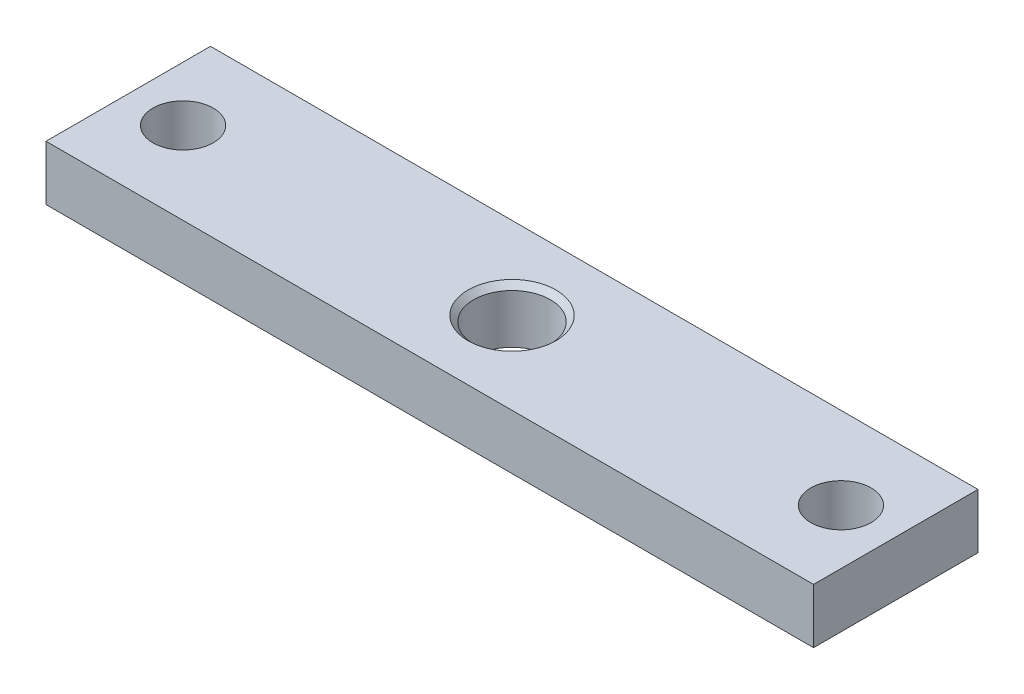
ISO-10303-21;
HEADER;
FILE_DESCRIPTION(('STEP AP214'),'2;1');
FILE_NAME('part.step','',(''),(''),'','','');
FILE_SCHEMA(('AUTOMOTIVE_DESIGN { 1 0 10303 214 1 1 1 1 }'));
ENDSEC;
DATA;
#1=APPLICATION_CONTEXT('core data for automotive mechanical design processes');
#2=APPLICATION_PROTOCOL_DEFINITION('international standard','automotive_design',2000,#1);
#3=PRODUCT_CONTEXT('',#1,'mechanical');
#4=PRODUCT('Part','Part','',(#3));
#5=PRODUCT_RELATED_PRODUCT_CATEGORY('part','',(#4));
#6=PRODUCT_DEFINITION_FORMATION('','',#4);
#7=PRODUCT_DEFINITION_CONTEXT('part definition',#1,'design');
#8=PRODUCT_DEFINITION('design','',#6,#7);
#9=PRODUCT_DEFINITION_SHAPE('','',#8);
#10=(LENGTH_UNIT() NAMED_UNIT(*) SI_UNIT(.MILLI.,.METRE.));
#11=(NAMED_UNIT(*) PLANE_ANGLE_UNIT() SI_UNIT($,.RADIAN.));
#12=(NAMED_UNIT(*) SI_UNIT($,.STERADIAN.) SOLID_ANGLE_UNIT());
#13=UNCERTAINTY_MEASURE_WITH_UNIT(LENGTH_MEASURE(1.E-05),#10,'distance_accuracy_value','');
#14=(GEOMETRIC_REPRESENTATION_CONTEXT(3) GLOBAL_UNCERTAINTY_ASSIGNED_CONTEXT((#13)) GLOBAL_UNIT_ASSIGNED_CONTEXT((#10,
#11,#12)) REPRESENTATION_CONTEXT('',''));
#15=CARTESIAN_POINT('',(0.,0.,0.));
#16=DIRECTION('',(0.,0.,1.));
#17=DIRECTION('',(1.,0.,0.));
#18=AXIS2_PLACEMENT_3D('',#15,#16,#17);
#19=CARTESIAN_POINT('',(70.,5.,-15.));
#20=DIRECTION('',(-1.,0.,0.));
#21=DIRECTION('',(0.,0.,1.));
#22=AXIS2_PLACEMENT_3D('',#19,#20,#21);
#23=PLANE('',#22);
#24=DIRECTION('',(0.,0.,-1.));
#25=VECTOR('',#24,1.);
#26=CARTESIAN_POINT('',(70.,-5.,-15.));
#27=LINE('',#26,#25);
#28=CARTESIAN_POINT('',(70.,-5.,15.));
#29=VERTEX_POINT('',#28);
#30=CARTESIAN_POINT('',(70.,-5.,-15.));
#31=VERTEX_POINT('',#30);
#32=EDGE_CURVE('E102',#29,#31,#27,.T.);
#33=ORIENTED_EDGE('',*,*,#32,.T.);
#34=DIRECTION('',(0.,-1.,0.));
#35=VECTOR('',#34,1.);
#36=CARTESIAN_POINT('',(70.,5.,-15.));
#37=LINE('',#36,#35);
#38=CARTESIAN_POINT('',(70.,5.,-15.));
#39=VERTEX_POINT('',#38);
#40=EDGE_CURVE('E11',#39,#31,#37,.T.);
#41=ORIENTED_EDGE('',*,*,#40,.F.);
#42=DIRECTION('',(0.,0.,-1.));
#43=VECTOR('',#42,1.);
#44=CARTESIAN_POINT('',(70.,5.,-15.));
#45=LINE('',#44,#43);
#46=CARTESIAN_POINT('',(70.,5.,15.));
#47=VERTEX_POINT('',#46);
#48=EDGE_CURVE('E89',#47,#39,#45,.T.);
#49=ORIENTED_EDGE('',*,*,#48,.F.);
#50=DIRECTION('',(0.,-1.,0.));
#51=VECTOR('',#50,1.);
#52=CARTESIAN_POINT('',(70.,5.,15.));
#53=LINE('',#52,#51);
#54=EDGE_CURVE('E98',#47,#29,#53,.T.);
#55=ORIENTED_EDGE('',*,*,#54,.T.);
#56=EDGE_LOOP('',(#33,#41,#49,#55));
#57=FACE_BOUND('',#56,.T.);
#58=ADVANCED_FACE('F36',(#57),#23,.F.);
#59=CARTESIAN_POINT('',(-70.,5.,-15.));
#60=DIRECTION('',(0.,0.,1.));
#61=DIRECTION('',(1.,0.,0.));
#62=AXIS2_PLACEMENT_3D('',#59,#60,#61);
#63=PLANE('',#62);
#64=DIRECTION('',(-1.,0.,0.));
#65=VECTOR('',#64,1.);
#66=CARTESIAN_POINT('',(-70.,-5.,-15.));
#67=LINE('',#66,#65);
#68=CARTESIAN_POINT('',(-70.,-5.,-15.));
#69=VERTEX_POINT('',#68);
#70=EDGE_CURVE('E93',#31,#69,#67,.T.);
#71=ORIENTED_EDGE('',*,*,#70,.T.);
#72=DIRECTION('',(0.,-1.,0.));
#73=VECTOR('',#72,1.);
#74=CARTESIAN_POINT('',(-70.,5.,-15.));
#75=LINE('',#74,#73);
#76=CARTESIAN_POINT('',(-70.,5.,-15.));
#77=VERTEX_POINT('',#76);
#78=EDGE_CURVE('E45',#77,#69,#75,.T.);
#79=ORIENTED_EDGE('',*,*,#78,.F.);
#80=DIRECTION('',(-1.,0.,0.));
#81=VECTOR('',#80,1.);
#82=CARTESIAN_POINT('',(-70.,5.,-15.));
#83=LINE('',#82,#81);
#84=EDGE_CURVE('E84',#39,#77,#83,.T.);
#85=ORIENTED_EDGE('',*,*,#84,.F.);
#86=ORIENTED_EDGE('',*,*,#40,.T.);
#87=EDGE_LOOP('',(#71,#79,#85,#86));
#88=FACE_BOUND('',#87,.T.);
#89=ADVANCED_FACE('F92',(#88),#63,.F.);
#90=CARTESIAN_POINT('',(-70.,5.,-15.));
#91=DIRECTION('',(1.,0.,0.));
#92=DIRECTION('',(0.,0.,-1.));
#93=AXIS2_PLACEMENT_3D('',#90,#91,#92);
#94=PLANE('',#93);
#95=DIRECTION('',(0.,0.,1.));
#96=VECTOR('',#95,1.);
#97=CARTESIAN_POINT('',(-70.,-5.,-15.));
#98=LINE('',#97,#96);
#99=CARTESIAN_POINT('',(-70.,-5.,15.));
#100=VERTEX_POINT('',#99);
#101=EDGE_CURVE('E71',#69,#100,#98,.T.);
#102=ORIENTED_EDGE('',*,*,#101,.T.);
#103=DIRECTION('',(0.,-1.,0.));
#104=VECTOR('',#103,1.);
#105=CARTESIAN_POINT('',(-70.,5.,15.));
#106=LINE('',#105,#104);
#107=CARTESIAN_POINT('',(-70.,5.,15.));
#108=VERTEX_POINT('',#107);
#109=EDGE_CURVE('E94',#108,#100,#106,.T.);
#110=ORIENTED_EDGE('',*,*,#109,.F.);
#111=DIRECTION('',(0.,0.,1.));
#112=VECTOR('',#111,1.);
#113=CARTESIAN_POINT('',(-70.,5.,-15.));
#114=LINE('',#113,#112);
#115=EDGE_CURVE('E87',#77,#108,#114,.T.);
#116=ORIENTED_EDGE('',*,*,#115,.F.);
#117=ORIENTED_EDGE('',*,*,#78,.T.);
#118=EDGE_LOOP('',(#102,#110,#116,#117));
#119=FACE_BOUND('',#118,.T.);
#120=ADVANCED_FACE('F96',(#119),#94,.F.);
#121=CARTESIAN_POINT('',(-70.,5.,15.));
#122=DIRECTION('',(0.,0.,-1.));
#123=DIRECTION('',(-1.,0.,0.));
#124=AXIS2_PLACEMENT_3D('',#121,#122,#123);
#125=PLANE('',#124);
#126=DIRECTION('',(1.,0.,0.));
#127=VECTOR('',#126,1.);
#128=CARTESIAN_POINT('',(-70.,-5.,15.));
#129=LINE('',#128,#127);
#130=EDGE_CURVE('E77',#100,#29,#129,.T.);
#131=ORIENTED_EDGE('',*,*,#130,.T.);
#132=ORIENTED_EDGE('',*,*,#54,.F.);
#133=DIRECTION('',(1.,0.,0.));
#134=VECTOR('',#133,1.);
#135=CARTESIAN_POINT('',(-70.,5.,15.));
#136=LINE('',#135,#134);
#137=EDGE_CURVE('E54',#108,#47,#136,.T.);
#138=ORIENTED_EDGE('',*,*,#137,.F.);
#139=ORIENTED_EDGE('',*,*,#109,.T.);
#140=EDGE_LOOP('',(#131,#132,#138,#139));
#141=FACE_BOUND('',#140,.T.);
#142=ADVANCED_FACE('F149',(#141),#125,.F.);
#143=CARTESIAN_POINT('',(0.,5.,0.));
#144=DIRECTION('',(0.,1.,0.));
#145=DIRECTION('',(0.,0.,1.));
#146=AXIS2_PLACEMENT_3D('',#143,#144,#145);
#147=PLANE('',#146);
#148=CARTESIAN_POINT('',(0.,5.,0.));
#149=DIRECTION('',(0.,1.,0.));
#150=DIRECTION('',(0.,0.,1.));
#151=AXIS2_PLACEMENT_3D('',#148,#149,#150);
#152=CIRCLE('',#151,8.025);
#153=CARTESIAN_POINT('',(0.,5.,8.025));
#154=VERTEX_POINT('',#153);
#155=EDGE_CURVE('E240',#154,#154,#152,.T.);
#156=ORIENTED_EDGE('',*,*,#155,.F.);
#157=EDGE_LOOP('',(#156));
#158=FACE_BOUND('',#157,.T.);
#159=CARTESIAN_POINT('',(-60.,5.,0.));
#160=DIRECTION('',(0.,1.,0.));
#161=DIRECTION('',(0.,0.,1.));
#162=AXIS2_PLACEMENT_3D('',#159,#160,#161);
#163=CIRCLE('',#162,5.5);
#164=CARTESIAN_POINT('',(-60.,5.,5.5));
#165=VERTEX_POINT('',#164);
#166=EDGE_CURVE('E113',#165,#165,#163,.T.);
#167=ORIENTED_EDGE('',*,*,#166,.F.);
#168=EDGE_LOOP('',(#167));
#169=FACE_BOUND('',#168,.T.);
#170=CARTESIAN_POINT('',(60.,5.,0.));
#171=DIRECTION('',(0.,1.,0.));
#172=DIRECTION('',(0.,0.,1.));
#173=AXIS2_PLACEMENT_3D('',#170,#171,#172);
#174=CIRCLE('',#173,5.49999999999999);
#175=CARTESIAN_POINT('',(60.,5.,5.49999999999999));
#176=VERTEX_POINT('',#175);
#177=EDGE_CURVE('E245',#176,#176,#174,.T.);
#178=ORIENTED_EDGE('',*,*,#177,.F.);
#179=EDGE_LOOP('',(#178));
#180=FACE_BOUND('',#179,.T.);
#181=ORIENTED_EDGE('',*,*,#48,.T.);
#182=ORIENTED_EDGE('',*,*,#84,.T.);
#183=ORIENTED_EDGE('',*,*,#115,.T.);
#184=ORIENTED_EDGE('',*,*,#137,.T.);
#185=EDGE_LOOP('',(#181,#182,#183,#184));
#186=FACE_BOUND('',#185,.T.);
#187=ADVANCED_FACE('F85',(#158,#169,#180,#186),#147,.T.);
#188=CARTESIAN_POINT('',(0.,-5.,0.));
#189=DIRECTION('',(0.,1.,0.));
#190=DIRECTION('',(0.,0.,1.));
#191=AXIS2_PLACEMENT_3D('',#188,#189,#190);
#192=PLANE('',#191);
#193=CARTESIAN_POINT('',(0.,-5.,0.));
#194=DIRECTION('',(0.,1.,0.));
#195=DIRECTION('',(0.,0.,1.));
#196=AXIS2_PLACEMENT_3D('',#193,#194,#195);
#197=CIRCLE('',#196,6.99999999999999);
#198=CARTESIAN_POINT('',(0.,-5.,6.99999999999999));
#199=VERTEX_POINT('',#198);
#200=EDGE_CURVE('E39',#199,#199,#197,.T.);
#201=ORIENTED_EDGE('',*,*,#200,.T.);
#202=EDGE_LOOP('',(#201));
#203=FACE_BOUND('',#202,.T.);
#204=CARTESIAN_POINT('',(-60.,-5.,0.));
#205=DIRECTION('',(0.,1.,0.));
#206=DIRECTION('',(0.,0.,1.));
#207=AXIS2_PLACEMENT_3D('',#204,#205,#206);
#208=CIRCLE('',#207,5.5);
#209=CARTESIAN_POINT('',(-60.,-5.,5.5));
#210=VERTEX_POINT('',#209);
#211=EDGE_CURVE('E105',#210,#210,#208,.T.);
#212=ORIENTED_EDGE('',*,*,#211,.T.);
#213=EDGE_LOOP('',(#212));
#214=FACE_BOUND('',#213,.T.);
#215=CARTESIAN_POINT('',(60.,-5.,0.));
#216=DIRECTION('',(0.,1.,0.));
#217=DIRECTION('',(0.,0.,1.));
#218=AXIS2_PLACEMENT_3D('',#215,#216,#217);
#219=CIRCLE('',#218,5.49999999999999);
#220=CARTESIAN_POINT('',(60.,-5.,5.49999999999999));
#221=VERTEX_POINT('',#220);
#222=EDGE_CURVE('E111',#221,#221,#219,.T.);
#223=ORIENTED_EDGE('',*,*,#222,.T.);
#224=EDGE_LOOP('',(#223));
#225=FACE_BOUND('',#224,.T.);
#226=ORIENTED_EDGE('',*,*,#32,.F.);
#227=ORIENTED_EDGE('',*,*,#130,.F.);
#228=ORIENTED_EDGE('',*,*,#101,.F.);
#229=ORIENTED_EDGE('',*,*,#70,.F.);
#230=EDGE_LOOP('',(#226,#227,#228,#229));
#231=FACE_BOUND('',#230,.T.);
#232=ADVANCED_FACE('F117',(#203,#214,#225,#231),#192,.F.);
#233=CARTESIAN_POINT('',(60.,-58.,0.));
#234=DIRECTION('',(0.,1.,0.));
#235=DIRECTION('',(0.,0.,1.));
#236=AXIS2_PLACEMENT_3D('',#233,#234,#235);
#237=CYLINDRICAL_SURFACE('',#236,5.49999999999999);
#238=ORIENTED_EDGE('',*,*,#177,.T.);
#239=EDGE_LOOP('',(#238));
#240=FACE_BOUND('',#239,.T.);
#241=ORIENTED_EDGE('',*,*,#222,.F.);
#242=EDGE_LOOP('',(#241));
#243=FACE_BOUND('',#242,.T.);
#244=ADVANCED_FACE('F123',(#240,#243),#237,.F.);
#245=CARTESIAN_POINT('',(-60.,-58.,0.));
#246=DIRECTION('',(0.,1.,0.));
#247=DIRECTION('',(0.,0.,1.));
#248=AXIS2_PLACEMENT_3D('',#245,#246,#247);
#249=CYLINDRICAL_SURFACE('',#248,5.5);
#250=ORIENTED_EDGE('',*,*,#166,.T.);
#251=EDGE_LOOP('',(#250));
#252=FACE_BOUND('',#251,.T.);
#253=ORIENTED_EDGE('',*,*,#211,.F.);
#254=EDGE_LOOP('',(#253));
#255=FACE_BOUND('',#254,.T.);
#256=ADVANCED_FACE('F120',(#252,#255),#249,.F.);
#257=CARTESIAN_POINT('',(0.,5.,0.));
#258=DIRECTION('',(0.,1.,0.));
#259=DIRECTION('',(0.,0.,1.));
#260=AXIS2_PLACEMENT_3D('',#257,#258,#259);
#261=CYLINDRICAL_SURFACE('',#260,6.99999999999999);
#262=CARTESIAN_POINT('',(0.,3.975,0.));
#263=DIRECTION('',(0.,1.,0.));
#264=DIRECTION('',(0.,0.,1.));
#265=AXIS2_PLACEMENT_3D('',#262,#263,#264);
#266=CIRCLE('',#265,7.);
#267=CARTESIAN_POINT('',(0.,3.975,7.));
#268=VERTEX_POINT('',#267);
#269=EDGE_CURVE('E237',#268,#268,#266,.T.);
#270=ORIENTED_EDGE('',*,*,#269,.T.);
#271=EDGE_LOOP('',(#270));
#272=FACE_BOUND('',#271,.T.);
#273=ORIENTED_EDGE('',*,*,#200,.F.);
#274=EDGE_LOOP('',(#273));
#275=FACE_BOUND('',#274,.T.);
#276=ADVANCED_FACE('F122',(#272,#275),#261,.F.);
#277=CARTESIAN_POINT('',(0.,5.,0.));
#278=DIRECTION('',(0.,1.,0.));
#279=DIRECTION('',(0.,0.,1.));
#280=AXIS2_PLACEMENT_3D('',#277,#278,#279);
#281=CONICAL_SURFACE('',#280,8.025,0.785398163397449);
#282=ORIENTED_EDGE('',*,*,#269,.F.);
#283=EDGE_LOOP('',(#282));
#284=FACE_BOUND('',#283,.T.);
#285=ORIENTED_EDGE('',*,*,#155,.T.);
#286=EDGE_LOOP('',(#285));
#287=FACE_BOUND('',#286,.T.);
#288=ADVANCED_FACE('F130',(#284,#287),#281,.F.);
#289=CLOSED_SHELL('',(#58,#89,#120,#142,#187,#232,#244,#256,#276,#288));
#290=MANIFOLD_SOLID_BREP('B2',#289);
#291=ADVANCED_BREP_SHAPE_REPRESENTATION('',(#18,#290),#14);
#292=SHAPE_DEFINITION_REPRESENTATION(#9,#291);
ENDSEC;
END-ISO-10303-21;
